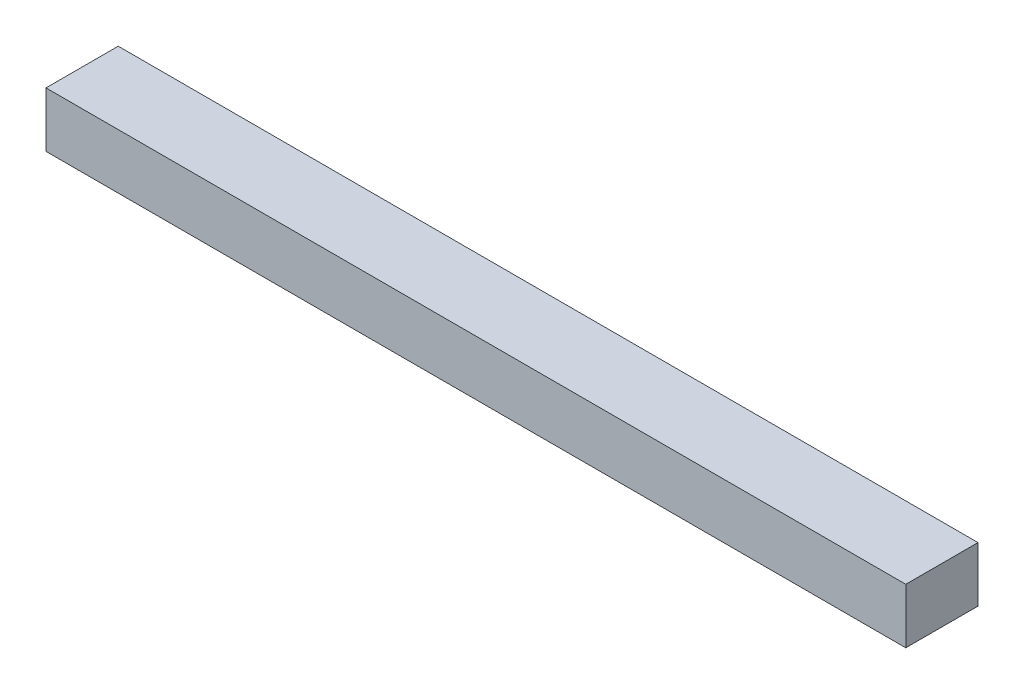
ISO-10303-21;
HEADER;
FILE_DESCRIPTION(('STEP AP214'),'2;1');
FILE_NAME('part.step','',(''),(''),'','','');
FILE_SCHEMA(('AUTOMOTIVE_DESIGN { 1 0 10303 214 1 1 1 1 }'));
ENDSEC;
DATA;
#1=APPLICATION_CONTEXT('core data for automotive mechanical design processes');
#2=APPLICATION_PROTOCOL_DEFINITION('international standard','automotive_design',2000,#1);
#3=PRODUCT_CONTEXT('',#1,'mechanical');
#4=PRODUCT('Part','Part','',(#3));
#5=PRODUCT_RELATED_PRODUCT_CATEGORY('part','',(#4));
#6=PRODUCT_DEFINITION_FORMATION('','',#4);
#7=PRODUCT_DEFINITION_CONTEXT('part definition',#1,'design');
#8=PRODUCT_DEFINITION('design','',#6,#7);
#9=PRODUCT_DEFINITION_SHAPE('','',#8);
#10=(LENGTH_UNIT() NAMED_UNIT(*) SI_UNIT(.MILLI.,.METRE.));
#11=(NAMED_UNIT(*) PLANE_ANGLE_UNIT() SI_UNIT($,.RADIAN.));
#12=(NAMED_UNIT(*) SI_UNIT($,.STERADIAN.) SOLID_ANGLE_UNIT());
#13=UNCERTAINTY_MEASURE_WITH_UNIT(LENGTH_MEASURE(1.E-05),#10,'distance_accuracy_value','');
#14=(GEOMETRIC_REPRESENTATION_CONTEXT(3) GLOBAL_UNCERTAINTY_ASSIGNED_CONTEXT((#13)) GLOBAL_UNIT_ASSIGNED_CONTEXT((#10,
#11,#12)) REPRESENTATION_CONTEXT('',''));
#15=CARTESIAN_POINT('',(0.,0.,0.));
#16=DIRECTION('',(0.,0.,1.));
#17=DIRECTION('',(1.,0.,0.));
#18=AXIS2_PLACEMENT_3D('',#15,#16,#17);
#19=CARTESIAN_POINT('',(-85.0515151515152,139.718484848485,210.));
#20=DIRECTION('',(1.,0.,0.));
#21=DIRECTION('',(0.,0.,-1.));
#22=AXIS2_PLACEMENT_3D('',#19,#20,#21);
#23=PLANE('',#22);
#24=DIRECTION('',(0.,-1.,0.));
#25=VECTOR('',#24,1.);
#26=CARTESIAN_POINT('',(-85.0515151515152,139.718484848485,0.));
#27=LINE('',#26,#25);
#28=CARTESIAN_POINT('',(-85.0515151515152,139.718484848485,0.));
#29=VERTEX_POINT('',#28);
#30=CARTESIAN_POINT('',(-85.0515151515152,-20.2815151515151,0.));
#31=VERTEX_POINT('',#30);
#32=EDGE_CURVE('E97',#29,#31,#27,.T.);
#33=ORIENTED_EDGE('',*,*,#32,.T.);
#34=DIRECTION('',(0.,0.,-1.));
#35=VECTOR('',#34,1.);
#36=CARTESIAN_POINT('',(-85.0515151515152,-20.2815151515151,210.));
#37=LINE('',#36,#35);
#38=CARTESIAN_POINT('',(-85.0515151515152,-20.2815151515151,210.));
#39=VERTEX_POINT('',#38);
#40=EDGE_CURVE('E11',#39,#31,#37,.T.);
#41=ORIENTED_EDGE('',*,*,#40,.F.);
#42=DIRECTION('',(0.,-1.,0.));
#43=VECTOR('',#42,1.);
#44=CARTESIAN_POINT('',(-85.0515151515152,139.718484848485,210.));
#45=LINE('',#44,#43);
#46=CARTESIAN_POINT('',(-85.0515151515152,139.718484848485,210.));
#47=VERTEX_POINT('',#46);
#48=EDGE_CURVE('E85',#47,#39,#45,.T.);
#49=ORIENTED_EDGE('',*,*,#48,.F.);
#50=DIRECTION('',(0.,0.,-1.));
#51=VECTOR('',#50,1.);
#52=CARTESIAN_POINT('',(-85.0515151515152,139.718484848485,210.));
#53=LINE('',#52,#51);
#54=EDGE_CURVE('E93',#47,#29,#53,.T.);
#55=ORIENTED_EDGE('',*,*,#54,.T.);
#56=EDGE_LOOP('',(#33,#41,#49,#55));
#57=FACE_BOUND('',#56,.T.);
#58=ADVANCED_FACE('F34',(#57),#23,.F.);
#59=CARTESIAN_POINT('',(-85.0515151515152,-20.2815151515151,210.));
#60=DIRECTION('',(0.,1.,0.));
#61=DIRECTION('',(0.,0.,1.));
#62=AXIS2_PLACEMENT_3D('',#59,#60,#61);
#63=PLANE('',#62);
#64=DIRECTION('',(1.,0.,0.));
#65=VECTOR('',#64,1.);
#66=CARTESIAN_POINT('',(-85.0515151515152,-20.2815151515151,0.));
#67=LINE('',#66,#65);
#68=CARTESIAN_POINT('',(2414.94848484848,-20.2815151515151,0.));
#69=VERTEX_POINT('',#68);
#70=EDGE_CURVE('E89',#31,#69,#67,.T.);
#71=ORIENTED_EDGE('',*,*,#70,.T.);
#72=DIRECTION('',(0.,0.,-1.));
#73=VECTOR('',#72,1.);
#74=CARTESIAN_POINT('',(2414.94848484848,-20.2815151515151,210.));
#75=LINE('',#74,#73);
#76=CARTESIAN_POINT('',(2414.94848484848,-20.2815151515151,210.));
#77=VERTEX_POINT('',#76);
#78=EDGE_CURVE('E42',#77,#69,#75,.T.);
#79=ORIENTED_EDGE('',*,*,#78,.F.);
#80=DIRECTION('',(1.,0.,0.));
#81=VECTOR('',#80,1.);
#82=CARTESIAN_POINT('',(-85.0515151515152,-20.2815151515151,210.));
#83=LINE('',#82,#81);
#84=EDGE_CURVE('E80',#39,#77,#83,.T.);
#85=ORIENTED_EDGE('',*,*,#84,.F.);
#86=ORIENTED_EDGE('',*,*,#40,.T.);
#87=EDGE_LOOP('',(#71,#79,#85,#86));
#88=FACE_BOUND('',#87,.T.);
#89=ADVANCED_FACE('F88',(#88),#63,.F.);
#90=CARTESIAN_POINT('',(2414.94848484848,139.718484848485,210.));
#91=DIRECTION('',(-1.,0.,0.));
#92=DIRECTION('',(0.,0.,1.));
#93=AXIS2_PLACEMENT_3D('',#90,#91,#92);
#94=PLANE('',#93);
#95=DIRECTION('',(0.,1.,0.));
#96=VECTOR('',#95,1.);
#97=CARTESIAN_POINT('',(2414.94848484848,139.718484848485,0.));
#98=LINE('',#97,#96);
#99=CARTESIAN_POINT('',(2414.94848484848,139.718484848485,0.));
#100=VERTEX_POINT('',#99);
#101=EDGE_CURVE('E67',#69,#100,#98,.T.);
#102=ORIENTED_EDGE('',*,*,#101,.T.);
#103=DIRECTION('',(0.,0.,-1.));
#104=VECTOR('',#103,1.);
#105=CARTESIAN_POINT('',(2414.94848484848,139.718484848485,210.));
#106=LINE('',#105,#104);
#107=CARTESIAN_POINT('',(2414.94848484848,139.718484848485,210.));
#108=VERTEX_POINT('',#107);
#109=EDGE_CURVE('E90',#108,#100,#106,.T.);
#110=ORIENTED_EDGE('',*,*,#109,.F.);
#111=DIRECTION('',(0.,1.,0.));
#112=VECTOR('',#111,1.);
#113=CARTESIAN_POINT('',(2414.94848484848,139.718484848485,210.));
#114=LINE('',#113,#112);
#115=EDGE_CURVE('E83',#77,#108,#114,.T.);
#116=ORIENTED_EDGE('',*,*,#115,.F.);
#117=ORIENTED_EDGE('',*,*,#78,.T.);
#118=EDGE_LOOP('',(#102,#110,#116,#117));
#119=FACE_BOUND('',#118,.T.);
#120=ADVANCED_FACE('F91',(#119),#94,.F.);
#121=CARTESIAN_POINT('',(-85.0515151515152,139.718484848485,210.));
#122=DIRECTION('',(0.,-1.,0.));
#123=DIRECTION('',(0.,0.,-1.));
#124=AXIS2_PLACEMENT_3D('',#121,#122,#123);
#125=PLANE('',#124);
#126=DIRECTION('',(-1.,0.,0.));
#127=VECTOR('',#126,1.);
#128=CARTESIAN_POINT('',(-85.0515151515152,139.718484848485,0.));
#129=LINE('',#128,#127);
#130=EDGE_CURVE('E73',#100,#29,#129,.T.);
#131=ORIENTED_EDGE('',*,*,#130,.T.);
#132=ORIENTED_EDGE('',*,*,#54,.F.);
#133=DIRECTION('',(-1.,0.,0.));
#134=VECTOR('',#133,1.);
#135=CARTESIAN_POINT('',(-85.0515151515152,139.718484848485,210.));
#136=LINE('',#135,#134);
#137=EDGE_CURVE('E50',#108,#47,#136,.T.);
#138=ORIENTED_EDGE('',*,*,#137,.F.);
#139=ORIENTED_EDGE('',*,*,#109,.T.);
#140=EDGE_LOOP('',(#131,#132,#138,#139));
#141=FACE_BOUND('',#140,.T.);
#142=ADVANCED_FACE('F104',(#141),#125,.F.);
#143=CARTESIAN_POINT('',(-85.0515151515152,-20.2815151515151,210.));
#144=DIRECTION('',(0.,0.,1.));
#145=DIRECTION('',(1.,0.,0.));
#146=AXIS2_PLACEMENT_3D('',#143,#144,#145);
#147=PLANE('',#146);
#148=ORIENTED_EDGE('',*,*,#48,.T.);
#149=ORIENTED_EDGE('',*,*,#84,.T.);
#150=ORIENTED_EDGE('',*,*,#115,.T.);
#151=ORIENTED_EDGE('',*,*,#137,.T.);
#152=EDGE_LOOP('',(#148,#149,#150,#151));
#153=FACE_BOUND('',#152,.T.);
#154=ADVANCED_FACE('F81',(#153),#147,.T.);
#155=CARTESIAN_POINT('',(-85.0515151515152,-20.2815151515151,0.));
#156=DIRECTION('',(0.,0.,1.));
#157=DIRECTION('',(1.,0.,0.));
#158=AXIS2_PLACEMENT_3D('',#155,#156,#157);
#159=PLANE('',#158);
#160=ORIENTED_EDGE('',*,*,#32,.F.);
#161=ORIENTED_EDGE('',*,*,#130,.F.);
#162=ORIENTED_EDGE('',*,*,#101,.F.);
#163=ORIENTED_EDGE('',*,*,#70,.F.);
#164=EDGE_LOOP('',(#160,#161,#162,#163));
#165=FACE_BOUND('',#164,.T.);
#166=ADVANCED_FACE('F107',(#165),#159,.F.);
#167=CLOSED_SHELL('',(#58,#89,#120,#142,#154,#166));
#168=MANIFOLD_SOLID_BREP('B2',#167);
#169=ADVANCED_BREP_SHAPE_REPRESENTATION('',(#18,#168),#14);
#170=SHAPE_DEFINITION_REPRESENTATION(#9,#169);
ENDSEC;
END-ISO-10303-21;
